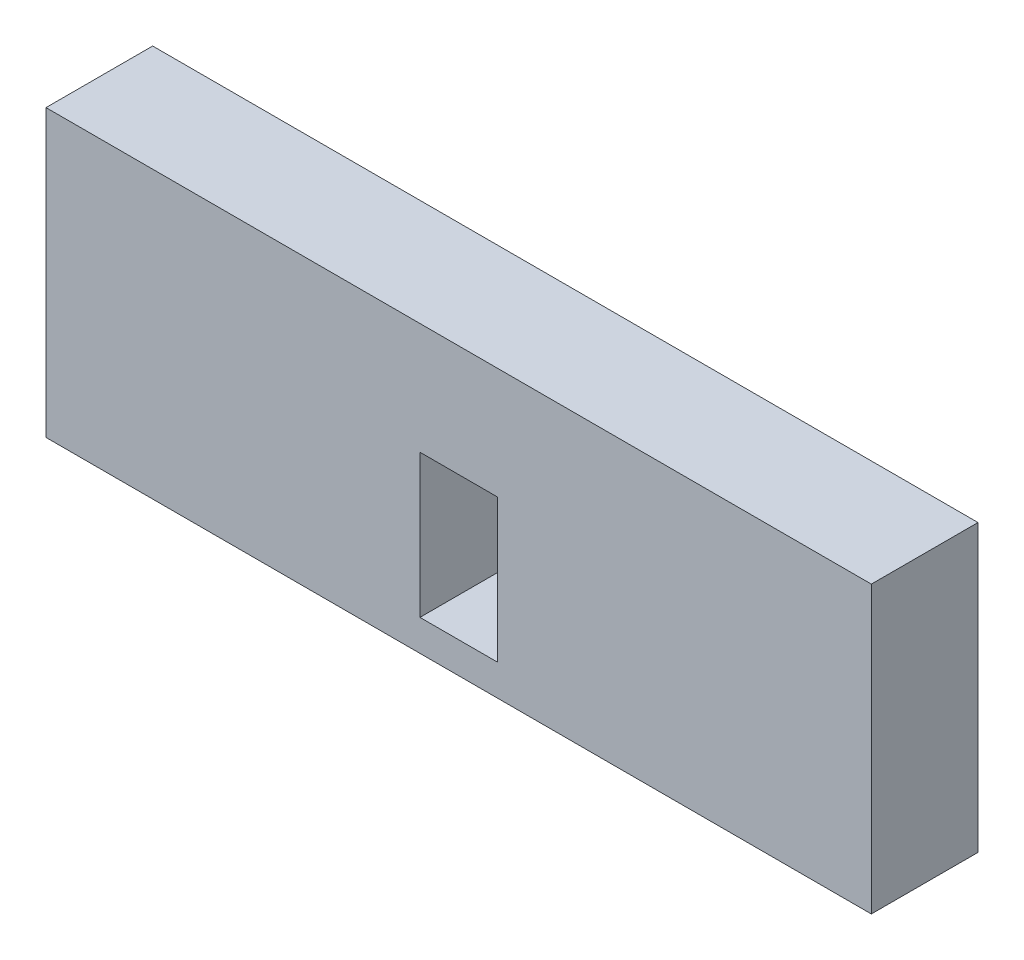
ISO-10303-21;
HEADER;
FILE_DESCRIPTION(('STEP AP214'),'2;1');
FILE_NAME('part.step','',(''),(''),'','','');
FILE_SCHEMA(('AUTOMOTIVE_DESIGN { 1 0 10303 214 1 1 1 1 }'));
ENDSEC;
DATA;
#1=APPLICATION_CONTEXT('core data for automotive mechanical design processes');
#2=APPLICATION_PROTOCOL_DEFINITION('international standard','automotive_design',2000,#1);
#3=PRODUCT_CONTEXT('',#1,'mechanical');
#4=PRODUCT('Part','Part','',(#3));
#5=PRODUCT_RELATED_PRODUCT_CATEGORY('part','',(#4));
#6=PRODUCT_DEFINITION_FORMATION('','',#4);
#7=PRODUCT_DEFINITION_CONTEXT('part definition',#1,'design');
#8=PRODUCT_DEFINITION('design','',#6,#7);
#9=PRODUCT_DEFINITION_SHAPE('','',#8);
#10=(LENGTH_UNIT() NAMED_UNIT(*) SI_UNIT(.MILLI.,.METRE.));
#11=(NAMED_UNIT(*) PLANE_ANGLE_UNIT() SI_UNIT($,.RADIAN.));
#12=(NAMED_UNIT(*) SI_UNIT($,.STERADIAN.) SOLID_ANGLE_UNIT());
#13=UNCERTAINTY_MEASURE_WITH_UNIT(LENGTH_MEASURE(1.E-05),#10,'distance_accuracy_value','');
#14=(GEOMETRIC_REPRESENTATION_CONTEXT(3) GLOBAL_UNCERTAINTY_ASSIGNED_CONTEXT((#13)) GLOBAL_UNIT_ASSIGNED_CONTEXT((#10,
#11,#12)) REPRESENTATION_CONTEXT('',''));
#15=CARTESIAN_POINT('',(0.,0.,0.));
#16=DIRECTION('',(0.,0.,1.));
#17=DIRECTION('',(1.,0.,0.));
#18=AXIS2_PLACEMENT_3D('',#15,#16,#17);
#19=CARTESIAN_POINT('',(0.,0.,16.8));
#20=DIRECTION('',(1.,0.,0.));
#21=DIRECTION('',(0.,0.,-1.));
#22=AXIS2_PLACEMENT_3D('',#19,#20,#21);
#23=PLANE('',#22);
#24=DIRECTION('',(0.,-1.,0.));
#25=VECTOR('',#24,1.);
#26=CARTESIAN_POINT('',(0.,0.,0.));
#27=LINE('',#26,#25);
#28=CARTESIAN_POINT('',(0.,45.,0.));
#29=VERTEX_POINT('',#28);
#30=CARTESIAN_POINT('',(0.,0.,0.));
#31=VERTEX_POINT('',#30);
#32=EDGE_CURVE('E147',#29,#31,#27,.T.);
#33=ORIENTED_EDGE('',*,*,#32,.T.);
#34=DIRECTION('',(0.,0.,-1.));
#35=VECTOR('',#34,1.);
#36=CARTESIAN_POINT('',(0.,0.,16.8));
#37=LINE('',#36,#35);
#38=CARTESIAN_POINT('',(0.,0.,16.8));
#39=VERTEX_POINT('',#38);
#40=EDGE_CURVE('E11',#39,#31,#37,.T.);
#41=ORIENTED_EDGE('',*,*,#40,.F.);
#42=DIRECTION('',(0.,-1.,0.));
#43=VECTOR('',#42,1.);
#44=CARTESIAN_POINT('',(0.,0.,16.8));
#45=LINE('',#44,#43);
#46=CARTESIAN_POINT('',(0.,45.,16.8));
#47=VERTEX_POINT('',#46);
#48=EDGE_CURVE('E153',#47,#39,#45,.T.);
#49=ORIENTED_EDGE('',*,*,#48,.F.);
#50=DIRECTION('',(0.,0.,-1.));
#51=VECTOR('',#50,1.);
#52=CARTESIAN_POINT('',(0.,45.,16.8));
#53=LINE('',#52,#51);
#54=EDGE_CURVE('E167',#47,#29,#53,.T.);
#55=ORIENTED_EDGE('',*,*,#54,.T.);
#56=EDGE_LOOP('',(#33,#41,#49,#55));
#57=FACE_BOUND('',#56,.T.);
#58=ADVANCED_FACE('F39',(#57),#23,.F.);
#59=CARTESIAN_POINT('',(0.,0.,16.8));
#60=DIRECTION('',(0.,1.,0.));
#61=DIRECTION('',(0.,0.,1.));
#62=AXIS2_PLACEMENT_3D('',#59,#60,#61);
#63=PLANE('',#62);
#64=DIRECTION('',(1.,0.,0.));
#65=VECTOR('',#64,1.);
#66=CARTESIAN_POINT('',(0.,0.,0.));
#67=LINE('',#66,#65);
#68=CARTESIAN_POINT('',(130.,0.,0.));
#69=VERTEX_POINT('',#68);
#70=EDGE_CURVE('E171',#31,#69,#67,.T.);
#71=ORIENTED_EDGE('',*,*,#70,.T.);
#72=DIRECTION('',(0.,0.,-1.));
#73=VECTOR('',#72,1.);
#74=CARTESIAN_POINT('',(130.,0.,16.8));
#75=LINE('',#74,#73);
#76=CARTESIAN_POINT('',(130.,0.,16.8));
#77=VERTEX_POINT('',#76);
#78=EDGE_CURVE('E47',#77,#69,#75,.T.);
#79=ORIENTED_EDGE('',*,*,#78,.F.);
#80=DIRECTION('',(1.,0.,0.));
#81=VECTOR('',#80,1.);
#82=CARTESIAN_POINT('',(0.,0.,16.8));
#83=LINE('',#82,#81);
#84=EDGE_CURVE('E157',#39,#77,#83,.T.);
#85=ORIENTED_EDGE('',*,*,#84,.F.);
#86=ORIENTED_EDGE('',*,*,#40,.T.);
#87=EDGE_LOOP('',(#71,#79,#85,#86));
#88=FACE_BOUND('',#87,.T.);
#89=ADVANCED_FACE('F205',(#88),#63,.F.);
#90=CARTESIAN_POINT('',(130.,0.,16.8));
#91=DIRECTION('',(-1.,0.,0.));
#92=DIRECTION('',(0.,0.,1.));
#93=AXIS2_PLACEMENT_3D('',#90,#91,#92);
#94=PLANE('',#93);
#95=DIRECTION('',(0.,1.,0.));
#96=VECTOR('',#95,1.);
#97=CARTESIAN_POINT('',(130.,0.,0.));
#98=LINE('',#97,#96);
#99=CARTESIAN_POINT('',(130.,45.,0.));
#100=VERTEX_POINT('',#99);
#101=EDGE_CURVE('E174',#69,#100,#98,.T.);
#102=ORIENTED_EDGE('',*,*,#101,.T.);
#103=DIRECTION('',(0.,0.,-1.));
#104=VECTOR('',#103,1.);
#105=CARTESIAN_POINT('',(130.,45.,16.8));
#106=LINE('',#105,#104);
#107=CARTESIAN_POINT('',(130.,45.,16.8));
#108=VERTEX_POINT('',#107);
#109=EDGE_CURVE('E182',#108,#100,#106,.T.);
#110=ORIENTED_EDGE('',*,*,#109,.F.);
#111=DIRECTION('',(0.,1.,0.));
#112=VECTOR('',#111,1.);
#113=CARTESIAN_POINT('',(130.,0.,16.8));
#114=LINE('',#113,#112);
#115=EDGE_CURVE('E161',#77,#108,#114,.T.);
#116=ORIENTED_EDGE('',*,*,#115,.F.);
#117=ORIENTED_EDGE('',*,*,#78,.T.);
#118=EDGE_LOOP('',(#102,#110,#116,#117));
#119=FACE_BOUND('',#118,.T.);
#120=ADVANCED_FACE('F191',(#119),#94,.F.);
#121=CARTESIAN_POINT('',(0.,45.,16.8));
#122=DIRECTION('',(0.,-1.,0.));
#123=DIRECTION('',(0.,0.,-1.));
#124=AXIS2_PLACEMENT_3D('',#121,#122,#123);
#125=PLANE('',#124);
#126=DIRECTION('',(-1.,0.,0.));
#127=VECTOR('',#126,1.);
#128=CARTESIAN_POINT('',(0.,45.,0.));
#129=LINE('',#128,#127);
#130=EDGE_CURVE('E158',#100,#29,#129,.T.);
#131=ORIENTED_EDGE('',*,*,#130,.T.);
#132=ORIENTED_EDGE('',*,*,#54,.F.);
#133=DIRECTION('',(-1.,0.,0.));
#134=VECTOR('',#133,1.);
#135=CARTESIAN_POINT('',(0.,45.,16.8));
#136=LINE('',#135,#134);
#137=EDGE_CURVE('E164',#108,#47,#136,.T.);
#138=ORIENTED_EDGE('',*,*,#137,.F.);
#139=ORIENTED_EDGE('',*,*,#109,.T.);
#140=EDGE_LOOP('',(#131,#132,#138,#139));
#141=FACE_BOUND('',#140,.T.);
#142=ADVANCED_FACE('F198',(#141),#125,.F.);
#143=CARTESIAN_POINT('',(0.,0.,16.8));
#144=DIRECTION('',(0.,0.,-1.));
#145=DIRECTION('',(-1.,0.,0.));
#146=AXIS2_PLACEMENT_3D('',#143,#144,#145);
#147=PLANE('',#146);
#148=DIRECTION('',(1.,0.,0.));
#149=VECTOR('',#148,1.);
#150=CARTESIAN_POINT('',(58.9,4.90999999999997,16.8));
#151=LINE('',#150,#149);
#152=CARTESIAN_POINT('',(58.9,4.90999999999997,16.8));
#153=VERTEX_POINT('',#152);
#154=CARTESIAN_POINT('',(71.1,4.90999999999997,16.8));
#155=VERTEX_POINT('',#154);
#156=EDGE_CURVE('E138',#153,#155,#151,.T.);
#157=ORIENTED_EDGE('',*,*,#156,.F.);
#158=DIRECTION('',(0.,-1.,0.));
#159=VECTOR('',#158,1.);
#160=CARTESIAN_POINT('',(58.9,4.90999999999997,16.8));
#161=LINE('',#160,#159);
#162=CARTESIAN_POINT('',(58.9,27.44,16.8));
#163=VERTEX_POINT('',#162);
#164=EDGE_CURVE('E54',#163,#153,#161,.T.);
#165=ORIENTED_EDGE('',*,*,#164,.F.);
#166=DIRECTION('',(-1.,0.,0.));
#167=VECTOR('',#166,1.);
#168=CARTESIAN_POINT('',(58.9,27.44,16.8));
#169=LINE('',#168,#167);
#170=CARTESIAN_POINT('',(71.1,27.44,16.8));
#171=VERTEX_POINT('',#170);
#172=EDGE_CURVE('E125',#171,#163,#169,.T.);
#173=ORIENTED_EDGE('',*,*,#172,.F.);
#174=DIRECTION('',(0.,1.,0.));
#175=VECTOR('',#174,1.);
#176=CARTESIAN_POINT('',(71.1,4.90999999999997,16.8));
#177=LINE('',#176,#175);
#178=EDGE_CURVE('E129',#155,#171,#177,.T.);
#179=ORIENTED_EDGE('',*,*,#178,.F.);
#180=EDGE_LOOP('',(#157,#165,#173,#179));
#181=FACE_BOUND('',#180,.T.);
#182=ORIENTED_EDGE('',*,*,#48,.T.);
#183=ORIENTED_EDGE('',*,*,#84,.T.);
#184=ORIENTED_EDGE('',*,*,#115,.T.);
#185=ORIENTED_EDGE('',*,*,#137,.T.);
#186=EDGE_LOOP('',(#182,#183,#184,#185));
#187=FACE_BOUND('',#186,.T.);
#188=ADVANCED_FACE('F204',(#181,#187),#147,.F.);
#189=CARTESIAN_POINT('',(0.,0.,0.));
#190=DIRECTION('',(0.,0.,-1.));
#191=DIRECTION('',(-1.,0.,0.));
#192=AXIS2_PLACEMENT_3D('',#189,#190,#191);
#193=PLANE('',#192);
#194=DIRECTION('',(0.,-1.,0.));
#195=VECTOR('',#194,1.);
#196=CARTESIAN_POINT('',(58.9,4.90999999999997,0.));
#197=LINE('',#196,#195);
#198=CARTESIAN_POINT('',(58.9,27.44,0.));
#199=VERTEX_POINT('',#198);
#200=CARTESIAN_POINT('',(58.9,4.90999999999997,0.));
#201=VERTEX_POINT('',#200);
#202=EDGE_CURVE('E106',#199,#201,#197,.T.);
#203=ORIENTED_EDGE('',*,*,#202,.T.);
#204=DIRECTION('',(1.,0.,0.));
#205=VECTOR('',#204,1.);
#206=CARTESIAN_POINT('',(58.9,4.90999999999997,0.));
#207=LINE('',#206,#205);
#208=CARTESIAN_POINT('',(71.1,4.90999999999997,0.));
#209=VERTEX_POINT('',#208);
#210=EDGE_CURVE('E116',#201,#209,#207,.T.);
#211=ORIENTED_EDGE('',*,*,#210,.T.);
#212=DIRECTION('',(0.,1.,0.));
#213=VECTOR('',#212,1.);
#214=CARTESIAN_POINT('',(71.1,4.90999999999997,0.));
#215=LINE('',#214,#213);
#216=CARTESIAN_POINT('',(71.1,27.44,0.));
#217=VERTEX_POINT('',#216);
#218=EDGE_CURVE('E62',#209,#217,#215,.T.);
#219=ORIENTED_EDGE('',*,*,#218,.T.);
#220=DIRECTION('',(-1.,0.,0.));
#221=VECTOR('',#220,1.);
#222=CARTESIAN_POINT('',(58.9,27.44,0.));
#223=LINE('',#222,#221);
#224=EDGE_CURVE('E113',#217,#199,#223,.T.);
#225=ORIENTED_EDGE('',*,*,#224,.T.);
#226=EDGE_LOOP('',(#203,#211,#219,#225));
#227=FACE_BOUND('',#226,.T.);
#228=ORIENTED_EDGE('',*,*,#32,.F.);
#229=ORIENTED_EDGE('',*,*,#130,.F.);
#230=ORIENTED_EDGE('',*,*,#101,.F.);
#231=ORIENTED_EDGE('',*,*,#70,.F.);
#232=EDGE_LOOP('',(#228,#229,#230,#231));
#233=FACE_BOUND('',#232,.T.);
#234=ADVANCED_FACE('F121',(#227,#233),#193,.T.);
#235=CARTESIAN_POINT('',(58.9,4.90999999999997,0.));
#236=DIRECTION('',(-1.,0.,0.));
#237=DIRECTION('',(0.,-1.,0.));
#238=AXIS2_PLACEMENT_3D('',#235,#236,#237);
#239=PLANE('',#238);
#240=ORIENTED_EDGE('',*,*,#164,.T.);
#241=DIRECTION('',(0.,0.,1.));
#242=VECTOR('',#241,1.);
#243=CARTESIAN_POINT('',(58.9,4.90999999999997,0.));
#244=LINE('',#243,#242);
#245=EDGE_CURVE('E102',#201,#153,#244,.T.);
#246=ORIENTED_EDGE('',*,*,#245,.F.);
#247=ORIENTED_EDGE('',*,*,#202,.F.);
#248=DIRECTION('',(0.,0.,1.));
#249=VECTOR('',#248,1.);
#250=CARTESIAN_POINT('',(58.9,27.44,0.));
#251=LINE('',#250,#249);
#252=EDGE_CURVE('E144',#199,#163,#251,.T.);
#253=ORIENTED_EDGE('',*,*,#252,.T.);
#254=EDGE_LOOP('',(#240,#246,#247,#253));
#255=FACE_BOUND('',#254,.T.);
#256=ADVANCED_FACE('F104',(#255),#239,.F.);
#257=CARTESIAN_POINT('',(58.9,27.44,0.));
#258=DIRECTION('',(0.,1.,0.));
#259=DIRECTION('',(0.,0.,1.));
#260=AXIS2_PLACEMENT_3D('',#257,#258,#259);
#261=PLANE('',#260);
#262=ORIENTED_EDGE('',*,*,#172,.T.);
#263=ORIENTED_EDGE('',*,*,#252,.F.);
#264=ORIENTED_EDGE('',*,*,#224,.F.);
#265=DIRECTION('',(0.,0.,1.));
#266=VECTOR('',#265,1.);
#267=CARTESIAN_POINT('',(71.1,27.44,0.));
#268=LINE('',#267,#266);
#269=EDGE_CURVE('E148',#217,#171,#268,.T.);
#270=ORIENTED_EDGE('',*,*,#269,.T.);
#271=EDGE_LOOP('',(#262,#263,#264,#270));
#272=FACE_BOUND('',#271,.T.);
#273=ADVANCED_FACE('F222',(#272),#261,.F.);
#274=CARTESIAN_POINT('',(71.1,4.90999999999997,0.));
#275=DIRECTION('',(1.,0.,0.));
#276=DIRECTION('',(0.,0.,-1.));
#277=AXIS2_PLACEMENT_3D('',#274,#275,#276);
#278=PLANE('',#277);
#279=ORIENTED_EDGE('',*,*,#178,.T.);
#280=ORIENTED_EDGE('',*,*,#269,.F.);
#281=ORIENTED_EDGE('',*,*,#218,.F.);
#282=DIRECTION('',(0.,0.,1.));
#283=VECTOR('',#282,1.);
#284=CARTESIAN_POINT('',(71.1,4.90999999999997,0.));
#285=LINE('',#284,#283);
#286=EDGE_CURVE('E112',#209,#155,#285,.T.);
#287=ORIENTED_EDGE('',*,*,#286,.T.);
#288=EDGE_LOOP('',(#279,#280,#281,#287));
#289=FACE_BOUND('',#288,.T.);
#290=ADVANCED_FACE('F225',(#289),#278,.F.);
#291=CARTESIAN_POINT('',(58.9,4.90999999999997,0.));
#292=DIRECTION('',(0.,-1.,0.));
#293=DIRECTION('',(0.,0.,-1.));
#294=AXIS2_PLACEMENT_3D('',#291,#292,#293);
#295=PLANE('',#294);
#296=ORIENTED_EDGE('',*,*,#156,.T.);
#297=ORIENTED_EDGE('',*,*,#286,.F.);
#298=ORIENTED_EDGE('',*,*,#210,.F.);
#299=ORIENTED_EDGE('',*,*,#245,.T.);
#300=EDGE_LOOP('',(#296,#297,#298,#299));
#301=FACE_BOUND('',#300,.T.);
#302=ADVANCED_FACE('F117',(#301),#295,.F.);
#303=CLOSED_SHELL('',(#58,#89,#120,#142,#188,#234,#256,#273,#290,#302));
#304=MANIFOLD_SOLID_BREP('B2',#303);
#305=ADVANCED_BREP_SHAPE_REPRESENTATION('',(#18,#304),#14);
#306=SHAPE_DEFINITION_REPRESENTATION(#9,#305);
ENDSEC;
END-ISO-10303-21;
